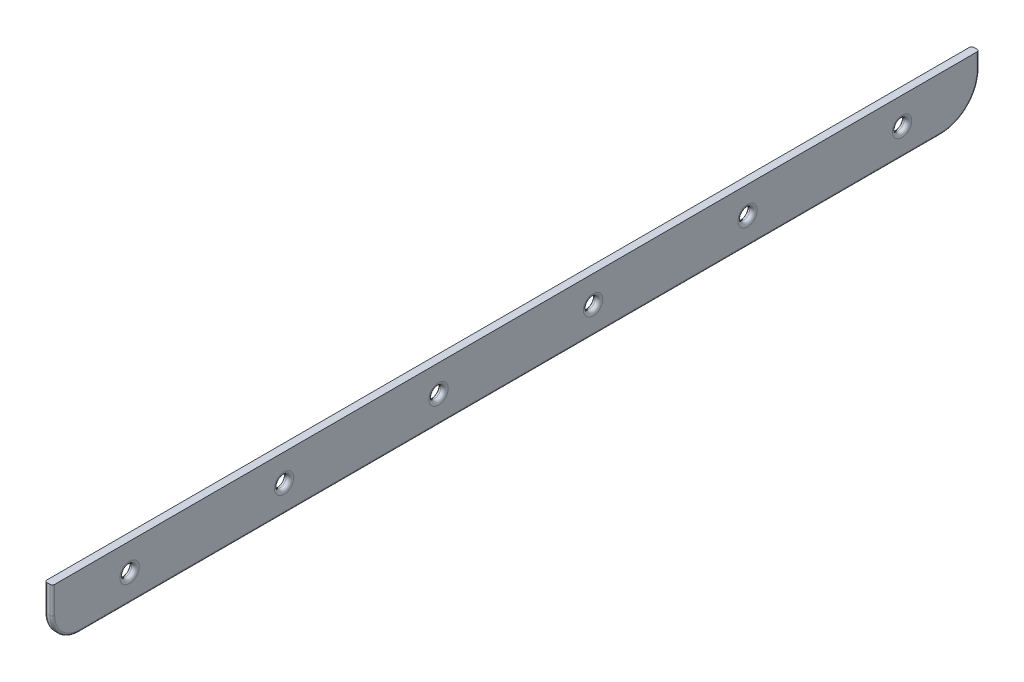
ISO-10303-21;
HEADER;
FILE_DESCRIPTION(('STEP AP214'),'2;1');
FILE_NAME('part.step','',(''),(''),'','','');
FILE_SCHEMA(('AUTOMOTIVE_DESIGN { 1 0 10303 214 1 1 1 1 }'));
ENDSEC;
DATA;
#1=APPLICATION_CONTEXT('core data for automotive mechanical design processes');
#2=APPLICATION_PROTOCOL_DEFINITION('international standard','automotive_design',2000,#1);
#3=PRODUCT_CONTEXT('',#1,'mechanical');
#4=PRODUCT('Part','Part','',(#3));
#5=PRODUCT_RELATED_PRODUCT_CATEGORY('part','',(#4));
#6=PRODUCT_DEFINITION_FORMATION('','',#4);
#7=PRODUCT_DEFINITION_CONTEXT('part definition',#1,'design');
#8=PRODUCT_DEFINITION('design','',#6,#7);
#9=PRODUCT_DEFINITION_SHAPE('','',#8);
#10=(LENGTH_UNIT() NAMED_UNIT(*) SI_UNIT(.MILLI.,.METRE.));
#11=(NAMED_UNIT(*) PLANE_ANGLE_UNIT() SI_UNIT($,.RADIAN.));
#12=(NAMED_UNIT(*) SI_UNIT($,.STERADIAN.) SOLID_ANGLE_UNIT());
#13=UNCERTAINTY_MEASURE_WITH_UNIT(LENGTH_MEASURE(1.E-05),#10,'distance_accuracy_value','');
#14=(GEOMETRIC_REPRESENTATION_CONTEXT(3) GLOBAL_UNCERTAINTY_ASSIGNED_CONTEXT((#13)) GLOBAL_UNIT_ASSIGNED_CONTEXT((#10,
#11,#12)) REPRESENTATION_CONTEXT('',''));
#15=CARTESIAN_POINT('',(0.,0.,0.));
#16=DIRECTION('',(0.,0.,1.));
#17=DIRECTION('',(1.,0.,0.));
#18=AXIS2_PLACEMENT_3D('',#15,#16,#17);
#19=CARTESIAN_POINT('',(10.,-35.0000000000001,565.));
#20=DIRECTION('',(1.,0.,0.));
#21=DIRECTION('',(0.,0.,-1.));
#22=AXIS2_PLACEMENT_3D('',#19,#20,#21);
#23=PLANE('',#22);
#24=CARTESIAN_POINT('',(10.,-35.0000000000001,-500.));
#25=DIRECTION('',(1.,0.,0.));
#26=DIRECTION('',(0.,0.,-1.));
#27=AXIS2_PLACEMENT_3D('',#24,#25,#26);
#28=CIRCLE('',#27,12.5);
#29=CARTESIAN_POINT('',(10.,-35.0000000000001,-512.5));
#30=VERTEX_POINT('',#29);
#31=EDGE_CURVE('E11',#30,#30,#28,.F.);
#32=ORIENTED_EDGE('',*,*,#31,.T.);
#33=EDGE_LOOP('',(#32));
#34=FACE_BOUND('',#33,.T.);
#35=CARTESIAN_POINT('',(10.,-35.0000000000001,-300.));
#36=DIRECTION('',(1.,0.,0.));
#37=DIRECTION('',(0.,0.,-1.));
#38=AXIS2_PLACEMENT_3D('',#35,#36,#37);
#39=CIRCLE('',#38,12.5);
#40=CARTESIAN_POINT('',(10.,-35.0000000000001,-312.5));
#41=VERTEX_POINT('',#40);
#42=EDGE_CURVE('E41',#41,#41,#39,.F.);
#43=ORIENTED_EDGE('',*,*,#42,.T.);
#44=EDGE_LOOP('',(#43));
#45=FACE_BOUND('',#44,.T.);
#46=CARTESIAN_POINT('',(10.,-35.0000000000001,-100.));
#47=DIRECTION('',(1.,0.,0.));
#48=DIRECTION('',(0.,0.,-1.));
#49=AXIS2_PLACEMENT_3D('',#46,#47,#48);
#50=CIRCLE('',#49,12.5);
#51=CARTESIAN_POINT('',(10.,-35.0000000000001,-112.5));
#52=VERTEX_POINT('',#51);
#53=EDGE_CURVE('E201',#52,#52,#50,.F.);
#54=ORIENTED_EDGE('',*,*,#53,.T.);
#55=EDGE_LOOP('',(#54));
#56=FACE_BOUND('',#55,.T.);
#57=CARTESIAN_POINT('',(10.,-35.0000000000001,100.));
#58=DIRECTION('',(1.,0.,0.));
#59=DIRECTION('',(0.,0.,-1.));
#60=AXIS2_PLACEMENT_3D('',#57,#58,#59);
#61=CIRCLE('',#60,12.5);
#62=CARTESIAN_POINT('',(10.,-35.0000000000001,87.5));
#63=VERTEX_POINT('',#62);
#64=EDGE_CURVE('E198',#63,#63,#61,.F.);
#65=ORIENTED_EDGE('',*,*,#64,.T.);
#66=EDGE_LOOP('',(#65));
#67=FACE_BOUND('',#66,.T.);
#68=CARTESIAN_POINT('',(10.,-35.0000000000001,300.));
#69=DIRECTION('',(1.,0.,0.));
#70=DIRECTION('',(0.,0.,-1.));
#71=AXIS2_PLACEMENT_3D('',#68,#69,#70);
#72=CIRCLE('',#71,12.5);
#73=CARTESIAN_POINT('',(10.,-35.0000000000001,287.5));
#74=VERTEX_POINT('',#73);
#75=EDGE_CURVE('E195',#74,#74,#72,.F.);
#76=ORIENTED_EDGE('',*,*,#75,.T.);
#77=EDGE_LOOP('',(#76));
#78=FACE_BOUND('',#77,.T.);
#79=CARTESIAN_POINT('',(10.,-35.0000000000001,500.));
#80=DIRECTION('',(1.,0.,0.));
#81=DIRECTION('',(0.,0.,-1.));
#82=AXIS2_PLACEMENT_3D('',#79,#80,#81);
#83=CIRCLE('',#82,12.5);
#84=CARTESIAN_POINT('',(10.,-35.0000000000001,487.5));
#85=VERTEX_POINT('',#84);
#86=EDGE_CURVE('E192',#85,#85,#83,.F.);
#87=ORIENTED_EDGE('',*,*,#86,.T.);
#88=EDGE_LOOP('',(#87));
#89=FACE_BOUND('',#88,.T.);
#90=DIRECTION('',(0.,0.,1.));
#91=VECTOR('',#90,1.);
#92=CARTESIAN_POINT('',(10.,2.25947334442687E-13,-600.));
#93=LINE('',#92,#91);
#94=CARTESIAN_POINT('',(10.,2.25028849343326E-13,-597.));
#95=VERTEX_POINT('',#94);
#96=CARTESIAN_POINT('',(10.,-1.40528220202159E-13,597.));
#97=VERTEX_POINT('',#96);
#98=EDGE_CURVE('E342',#95,#97,#93,.T.);
#99=ORIENTED_EDGE('',*,*,#98,.T.);
#100=DIRECTION('',(0.,-1.,0.));
#101=VECTOR('',#100,1.);
#102=CARTESIAN_POINT('',(10.,-35.0000000000001,597.));
#103=LINE('',#102,#101);
#104=CARTESIAN_POINT('',(10.,-35.0000000000001,597.));
#105=VERTEX_POINT('',#104);
#106=EDGE_CURVE('E343',#97,#105,#103,.T.);
#107=ORIENTED_EDGE('',*,*,#106,.T.);
#108=CARTESIAN_POINT('',(10.,-35.0000000000001,565.));
#109=DIRECTION('',(1.,0.,0.));
#110=DIRECTION('',(0.,0.,-1.));
#111=AXIS2_PLACEMENT_3D('',#108,#109,#110);
#112=CIRCLE('',#111,32.);
#113=CARTESIAN_POINT('',(10.,-67.0000000000001,565.));
#114=VERTEX_POINT('',#113);
#115=EDGE_CURVE('E153',#105,#114,#112,.T.);
#116=ORIENTED_EDGE('',*,*,#115,.T.);
#117=DIRECTION('',(0.,0.,-1.));
#118=VECTOR('',#117,1.);
#119=CARTESIAN_POINT('',(10.,-67.0000000000001,-550.));
#120=LINE('',#119,#118);
#121=CARTESIAN_POINT('',(10.,-67.0000000000001,-550.));
#122=VERTEX_POINT('',#121);
#123=EDGE_CURVE('E409',#114,#122,#120,.T.);
#124=ORIENTED_EDGE('',*,*,#123,.T.);
#125=CARTESIAN_POINT('',(10.,-20.0000000000001,-550.));
#126=DIRECTION('',(1.,0.,0.));
#127=DIRECTION('',(0.,0.,-1.));
#128=AXIS2_PLACEMENT_3D('',#125,#126,#127);
#129=CIRCLE('',#128,47.);
#130=CARTESIAN_POINT('',(10.,-20.0000000000001,-597.));
#131=VERTEX_POINT('',#130);
#132=EDGE_CURVE('E57',#122,#131,#129,.T.);
#133=ORIENTED_EDGE('',*,*,#132,.T.);
#134=DIRECTION('',(0.,1.,0.));
#135=VECTOR('',#134,1.);
#136=CARTESIAN_POINT('',(10.,2.28983498828939E-13,-597.));
#137=LINE('',#136,#135);
#138=EDGE_CURVE('E344',#131,#95,#137,.T.);
#139=ORIENTED_EDGE('',*,*,#138,.T.);
#140=EDGE_LOOP('',(#99,#107,#116,#124,#133,#139));
#141=FACE_BOUND('',#140,.T.);
#142=ADVANCED_FACE('F32',(#34,#45,#56,#67,#78,#89,#141),#23,.T.);
#143=CARTESIAN_POINT('',(0.,-35.0000000000001,565.));
#144=DIRECTION('',(1.,0.,0.));
#145=DIRECTION('',(0.,0.,-1.));
#146=AXIS2_PLACEMENT_3D('',#143,#144,#145);
#147=PLANE('',#146);
#148=CARTESIAN_POINT('',(0.,-35.0000000000001,-500.));
#149=DIRECTION('',(1.,0.,0.));
#150=DIRECTION('',(0.,0.,-1.));
#151=AXIS2_PLACEMENT_3D('',#148,#149,#150);
#152=CIRCLE('',#151,12.5);
#153=CARTESIAN_POINT('',(0.,-35.0000000000001,-512.5));
#154=VERTEX_POINT('',#153);
#155=EDGE_CURVE('E189',#154,#154,#152,.T.);
#156=ORIENTED_EDGE('',*,*,#155,.T.);
#157=EDGE_LOOP('',(#156));
#158=FACE_BOUND('',#157,.T.);
#159=CARTESIAN_POINT('',(0.,-35.0000000000001,-300.));
#160=DIRECTION('',(1.,0.,0.));
#161=DIRECTION('',(0.,0.,-1.));
#162=AXIS2_PLACEMENT_3D('',#159,#160,#161);
#163=CIRCLE('',#162,12.5);
#164=CARTESIAN_POINT('',(0.,-35.0000000000001,-312.5));
#165=VERTEX_POINT('',#164);
#166=EDGE_CURVE('E186',#165,#165,#163,.T.);
#167=ORIENTED_EDGE('',*,*,#166,.T.);
#168=EDGE_LOOP('',(#167));
#169=FACE_BOUND('',#168,.T.);
#170=CARTESIAN_POINT('',(0.,-35.0000000000001,-100.));
#171=DIRECTION('',(1.,0.,0.));
#172=DIRECTION('',(0.,0.,-1.));
#173=AXIS2_PLACEMENT_3D('',#170,#171,#172);
#174=CIRCLE('',#173,12.5);
#175=CARTESIAN_POINT('',(0.,-35.0000000000001,-112.5));
#176=VERTEX_POINT('',#175);
#177=EDGE_CURVE('E183',#176,#176,#174,.T.);
#178=ORIENTED_EDGE('',*,*,#177,.T.);
#179=EDGE_LOOP('',(#178));
#180=FACE_BOUND('',#179,.T.);
#181=CARTESIAN_POINT('',(0.,-35.0000000000001,100.));
#182=DIRECTION('',(1.,0.,0.));
#183=DIRECTION('',(0.,0.,-1.));
#184=AXIS2_PLACEMENT_3D('',#181,#182,#183);
#185=CIRCLE('',#184,12.5);
#186=CARTESIAN_POINT('',(0.,-35.0000000000001,87.5));
#187=VERTEX_POINT('',#186);
#188=EDGE_CURVE('E180',#187,#187,#185,.T.);
#189=ORIENTED_EDGE('',*,*,#188,.T.);
#190=EDGE_LOOP('',(#189));
#191=FACE_BOUND('',#190,.T.);
#192=CARTESIAN_POINT('',(0.,-35.0000000000001,300.));
#193=DIRECTION('',(1.,0.,0.));
#194=DIRECTION('',(0.,0.,-1.));
#195=AXIS2_PLACEMENT_3D('',#192,#193,#194);
#196=CIRCLE('',#195,12.5);
#197=CARTESIAN_POINT('',(0.,-35.0000000000001,287.5));
#198=VERTEX_POINT('',#197);
#199=EDGE_CURVE('E176',#198,#198,#196,.T.);
#200=ORIENTED_EDGE('',*,*,#199,.T.);
#201=EDGE_LOOP('',(#200));
#202=FACE_BOUND('',#201,.T.);
#203=CARTESIAN_POINT('',(0.,-35.0000000000001,500.));
#204=DIRECTION('',(1.,0.,0.));
#205=DIRECTION('',(0.,0.,-1.));
#206=AXIS2_PLACEMENT_3D('',#203,#204,#205);
#207=CIRCLE('',#206,12.5);
#208=CARTESIAN_POINT('',(0.,-35.0000000000001,487.5));
#209=VERTEX_POINT('',#208);
#210=EDGE_CURVE('E173',#209,#209,#207,.T.);
#211=ORIENTED_EDGE('',*,*,#210,.T.);
#212=EDGE_LOOP('',(#211));
#213=FACE_BOUND('',#212,.T.);
#214=CARTESIAN_POINT('',(0.,-35.0000000000001,565.));
#215=DIRECTION('',(1.,0.,0.));
#216=DIRECTION('',(0.,0.,-1.));
#217=AXIS2_PLACEMENT_3D('',#214,#215,#216);
#218=CIRCLE('',#217,32.);
#219=CARTESIAN_POINT('',(0.,-67.0000000000001,565.));
#220=VERTEX_POINT('',#219);
#221=CARTESIAN_POINT('',(0.,-35.0000000000001,597.));
#222=VERTEX_POINT('',#221);
#223=EDGE_CURVE('E390',#220,#222,#218,.F.);
#224=ORIENTED_EDGE('',*,*,#223,.T.);
#225=DIRECTION('',(0.,-1.,0.));
#226=VECTOR('',#225,1.);
#227=CARTESIAN_POINT('',(0.,-35.0000000000002,597.));
#228=LINE('',#227,#226);
#229=CARTESIAN_POINT('',(0.,-1.40528220202159E-13,597.));
#230=VERTEX_POINT('',#229);
#231=EDGE_CURVE('E392',#222,#230,#228,.F.);
#232=ORIENTED_EDGE('',*,*,#231,.T.);
#233=DIRECTION('',(0.,0.,1.));
#234=VECTOR('',#233,1.);
#235=CARTESIAN_POINT('',(0.,2.25947334442687E-13,-600.));
#236=LINE('',#235,#234);
#237=CARTESIAN_POINT('',(0.,2.25028849343326E-13,-597.));
#238=VERTEX_POINT('',#237);
#239=EDGE_CURVE('E347',#238,#230,#236,.T.);
#240=ORIENTED_EDGE('',*,*,#239,.F.);
#241=DIRECTION('',(0.,1.,0.));
#242=VECTOR('',#241,1.);
#243=CARTESIAN_POINT('',(0.,-35.0000000000001,-597.));
#244=LINE('',#243,#242);
#245=CARTESIAN_POINT('',(0.,-20.0000000000001,-597.));
#246=VERTEX_POINT('',#245);
#247=EDGE_CURVE('E388',#238,#246,#244,.F.);
#248=ORIENTED_EDGE('',*,*,#247,.T.);
#249=CARTESIAN_POINT('',(0.,-20.0000000000001,-550.));
#250=DIRECTION('',(1.,0.,0.));
#251=DIRECTION('',(0.,0.,-1.));
#252=AXIS2_PLACEMENT_3D('',#249,#250,#251);
#253=CIRCLE('',#252,47.);
#254=CARTESIAN_POINT('',(0.,-67.0000000000001,-550.));
#255=VERTEX_POINT('',#254);
#256=EDGE_CURVE('E386',#246,#255,#253,.F.);
#257=ORIENTED_EDGE('',*,*,#256,.T.);
#258=DIRECTION('',(0.,0.,-1.));
#259=VECTOR('',#258,1.);
#260=CARTESIAN_POINT('',(0.,-67.0000000000001,565.));
#261=LINE('',#260,#259);
#262=EDGE_CURVE('E384',#255,#220,#261,.F.);
#263=ORIENTED_EDGE('',*,*,#262,.T.);
#264=EDGE_LOOP('',(#224,#232,#240,#248,#257,#263));
#265=FACE_BOUND('',#264,.T.);
#266=ADVANCED_FACE('F234',(#158,#169,#180,#191,#202,#213,#265),#147,.F.);
#267=CARTESIAN_POINT('',(10.,2.25947334442687E-13,-600.));
#268=DIRECTION('',(0.,-1.,0.));
#269=DIRECTION('',(0.,0.,-1.));
#270=AXIS2_PLACEMENT_3D('',#267,#268,#269);
#271=PLANE('',#270);
#272=ORIENTED_EDGE('',*,*,#239,.T.);
#273=CARTESIAN_POINT('',(3.,-1.40528220202159E-13,597.));
#274=DIRECTION('',(0.,-1.,0.));
#275=DIRECTION('',(0.,0.,-1.));
#276=AXIS2_PLACEMENT_3D('',#273,#274,#275);
#277=CIRCLE('',#276,3.);
#278=CARTESIAN_POINT('',(3.,-1.41446705301519E-13,600.));
#279=VERTEX_POINT('',#278);
#280=EDGE_CURVE('E136',#230,#279,#277,.F.);
#281=ORIENTED_EDGE('',*,*,#280,.T.);
#282=DIRECTION('',(-1.,0.,0.));
#283=VECTOR('',#282,1.);
#284=CARTESIAN_POINT('',(10.,-1.41446705301519E-13,600.));
#285=LINE('',#284,#283);
#286=CARTESIAN_POINT('',(7.,-1.41446705301519E-13,600.));
#287=VERTEX_POINT('',#286);
#288=EDGE_CURVE('E146',#287,#279,#285,.T.);
#289=ORIENTED_EDGE('',*,*,#288,.F.);
#290=CARTESIAN_POINT('',(7.,-1.38777878078145E-13,597.));
#291=DIRECTION('',(0.,-1.,0.));
#292=DIRECTION('',(0.,0.,-1.));
#293=AXIS2_PLACEMENT_3D('',#290,#291,#292);
#294=CIRCLE('',#293,3.);
#295=EDGE_CURVE('E150',#287,#97,#294,.F.);
#296=ORIENTED_EDGE('',*,*,#295,.T.);
#297=ORIENTED_EDGE('',*,*,#98,.F.);
#298=CARTESIAN_POINT('',(7.,2.28983498828939E-13,-597.));
#299=DIRECTION('',(0.,-1.,0.));
#300=DIRECTION('',(0.,0.,-1.));
#301=AXIS2_PLACEMENT_3D('',#298,#299,#300);
#302=CIRCLE('',#301,3.);
#303=CARTESIAN_POINT('',(7.,2.25947334442687E-13,-600.));
#304=VERTEX_POINT('',#303);
#305=EDGE_CURVE('E394',#95,#304,#302,.F.);
#306=ORIENTED_EDGE('',*,*,#305,.T.);
#307=DIRECTION('',(-1.,0.,0.));
#308=VECTOR('',#307,1.);
#309=CARTESIAN_POINT('',(10.,2.25947334442687E-13,-600.));
#310=LINE('',#309,#308);
#311=CARTESIAN_POINT('',(3.,2.25947334442687E-13,-600.));
#312=VERTEX_POINT('',#311);
#313=EDGE_CURVE('E346',#304,#312,#310,.T.);
#314=ORIENTED_EDGE('',*,*,#313,.T.);
#315=CARTESIAN_POINT('',(3.,2.25514051876985E-13,-597.));
#316=DIRECTION('',(0.,-1.,0.));
#317=DIRECTION('',(0.,0.,-1.));
#318=AXIS2_PLACEMENT_3D('',#315,#316,#317);
#319=CIRCLE('',#318,3.);
#320=EDGE_CURVE('E397',#312,#238,#319,.F.);
#321=ORIENTED_EDGE('',*,*,#320,.T.);
#322=EDGE_LOOP('',(#272,#281,#289,#296,#297,#306,#314,#321));
#323=FACE_BOUND('',#322,.T.);
#324=ADVANCED_FACE('F240',(#323),#271,.F.);
#325=CARTESIAN_POINT('',(10.,-1.41446705301519E-13,600.));
#326=DIRECTION('',(0.,0.,-1.));
#327=DIRECTION('',(0.,1.,0.));
#328=AXIS2_PLACEMENT_3D('',#325,#326,#327);
#329=PLANE('',#328);
#330=ORIENTED_EDGE('',*,*,#288,.T.);
#331=DIRECTION('',(0.,-1.,0.));
#332=VECTOR('',#331,1.);
#333=CARTESIAN_POINT('',(3.,-1.41446705301519E-13,600.));
#334=LINE('',#333,#332);
#335=CARTESIAN_POINT('',(3.,-35.0000000000001,600.));
#336=VERTEX_POINT('',#335);
#337=EDGE_CURVE('E145',#279,#336,#334,.T.);
#338=ORIENTED_EDGE('',*,*,#337,.T.);
#339=DIRECTION('',(-1.,0.,0.));
#340=VECTOR('',#339,1.);
#341=CARTESIAN_POINT('',(10.,-35.0000000000001,600.));
#342=LINE('',#341,#340);
#343=CARTESIAN_POINT('',(7.,-35.0000000000001,600.));
#344=VERTEX_POINT('',#343);
#345=EDGE_CURVE('E129',#344,#336,#342,.T.);
#346=ORIENTED_EDGE('',*,*,#345,.F.);
#347=DIRECTION('',(0.,-1.,0.));
#348=VECTOR('',#347,1.);
#349=CARTESIAN_POINT('',(7.,-1.41355181528167E-13,600.));
#350=LINE('',#349,#348);
#351=EDGE_CURVE('E142',#344,#287,#350,.F.);
#352=ORIENTED_EDGE('',*,*,#351,.T.);
#353=EDGE_LOOP('',(#330,#338,#346,#352));
#354=FACE_BOUND('',#353,.T.);
#355=ADVANCED_FACE('F141',(#354),#329,.F.);
#356=CARTESIAN_POINT('',(10.,-35.0000000000001,565.));
#357=DIRECTION('',(-1.,0.,0.));
#358=DIRECTION('',(0.,0.,1.));
#359=AXIS2_PLACEMENT_3D('',#356,#357,#358);
#360=CYLINDRICAL_SURFACE('',#359,35.);
#361=ORIENTED_EDGE('',*,*,#345,.T.);
#362=CARTESIAN_POINT('',(3.,-35.0000000000001,565.));
#363=DIRECTION('',(1.,0.,0.));
#364=DIRECTION('',(0.,0.,-1.));
#365=AXIS2_PLACEMENT_3D('',#362,#363,#364);
#366=CIRCLE('',#365,35.);
#367=CARTESIAN_POINT('',(3.,-70.0000000000001,565.));
#368=VERTEX_POINT('',#367);
#369=EDGE_CURVE('E135',#336,#368,#366,.T.);
#370=ORIENTED_EDGE('',*,*,#369,.T.);
#371=DIRECTION('',(-1.,0.,0.));
#372=VECTOR('',#371,1.);
#373=CARTESIAN_POINT('',(10.,-70.0000000000001,565.));
#374=LINE('',#373,#372);
#375=CARTESIAN_POINT('',(7.,-70.0000000000001,565.));
#376=VERTEX_POINT('',#375);
#377=EDGE_CURVE('E131',#376,#368,#374,.T.);
#378=ORIENTED_EDGE('',*,*,#377,.F.);
#379=CARTESIAN_POINT('',(7.,-35.0000000000001,565.));
#380=DIRECTION('',(1.,0.,0.));
#381=DIRECTION('',(0.,0.,-1.));
#382=AXIS2_PLACEMENT_3D('',#379,#380,#381);
#383=CIRCLE('',#382,35.);
#384=EDGE_CURVE('E126',#376,#344,#383,.F.);
#385=ORIENTED_EDGE('',*,*,#384,.T.);
#386=EDGE_LOOP('',(#361,#370,#378,#385));
#387=FACE_BOUND('',#386,.T.);
#388=ADVANCED_FACE('F128',(#387),#360,.T.);
#389=CARTESIAN_POINT('',(10.,-70.0000000000001,565.));
#390=DIRECTION('',(0.,1.,0.));
#391=DIRECTION('',(0.,0.,1.));
#392=AXIS2_PLACEMENT_3D('',#389,#390,#391);
#393=PLANE('',#392);
#394=ORIENTED_EDGE('',*,*,#377,.T.);
#395=DIRECTION('',(0.,0.,-1.));
#396=VECTOR('',#395,1.);
#397=CARTESIAN_POINT('',(3.,-70.0000000000001,565.));
#398=LINE('',#397,#396);
#399=CARTESIAN_POINT('',(3.,-70.0000000000001,-550.));
#400=VERTEX_POINT('',#399);
#401=EDGE_CURVE('E177',#368,#400,#398,.T.);
#402=ORIENTED_EDGE('',*,*,#401,.T.);
#403=DIRECTION('',(-1.,0.,0.));
#404=VECTOR('',#403,1.);
#405=CARTESIAN_POINT('',(10.,-70.0000000000001,-550.));
#406=LINE('',#405,#404);
#407=CARTESIAN_POINT('',(7.,-70.0000000000001,-550.));
#408=VERTEX_POINT('',#407);
#409=EDGE_CURVE('E378',#408,#400,#406,.T.);
#410=ORIENTED_EDGE('',*,*,#409,.F.);
#411=DIRECTION('',(0.,0.,-1.));
#412=VECTOR('',#411,1.);
#413=CARTESIAN_POINT('',(7.,-70.0000000000001,565.));
#414=LINE('',#413,#412);
#415=EDGE_CURVE('E349',#408,#376,#414,.F.);
#416=ORIENTED_EDGE('',*,*,#415,.T.);
#417=EDGE_LOOP('',(#394,#402,#410,#416));
#418=FACE_BOUND('',#417,.T.);
#419=ADVANCED_FACE('F253',(#418),#393,.F.);
#420=CARTESIAN_POINT('',(10.,-20.0000000000001,-550.));
#421=DIRECTION('',(-1.,0.,0.));
#422=DIRECTION('',(0.,0.,1.));
#423=AXIS2_PLACEMENT_3D('',#420,#421,#422);
#424=CYLINDRICAL_SURFACE('',#423,50.);
#425=ORIENTED_EDGE('',*,*,#409,.T.);
#426=CARTESIAN_POINT('',(3.,-20.0000000000001,-550.));
#427=DIRECTION('',(1.,0.,0.));
#428=DIRECTION('',(0.,0.,-1.));
#429=AXIS2_PLACEMENT_3D('',#426,#427,#428);
#430=CIRCLE('',#429,50.);
#431=CARTESIAN_POINT('',(3.,-20.0000000000001,-600.));
#432=VERTEX_POINT('',#431);
#433=EDGE_CURVE('E407',#400,#432,#430,.T.);
#434=ORIENTED_EDGE('',*,*,#433,.T.);
#435=DIRECTION('',(-1.,0.,0.));
#436=VECTOR('',#435,1.);
#437=CARTESIAN_POINT('',(10.,-20.0000000000001,-600.));
#438=LINE('',#437,#436);
#439=CARTESIAN_POINT('',(7.,-20.0000000000001,-600.));
#440=VERTEX_POINT('',#439);
#441=EDGE_CURVE('E375',#440,#432,#438,.T.);
#442=ORIENTED_EDGE('',*,*,#441,.F.);
#443=CARTESIAN_POINT('',(7.,-20.0000000000001,-550.));
#444=DIRECTION('',(1.,0.,0.));
#445=DIRECTION('',(0.,0.,-1.));
#446=AXIS2_PLACEMENT_3D('',#443,#444,#445);
#447=CIRCLE('',#446,50.);
#448=EDGE_CURVE('E405',#440,#408,#447,.F.);
#449=ORIENTED_EDGE('',*,*,#448,.T.);
#450=EDGE_LOOP('',(#425,#434,#442,#449));
#451=FACE_BOUND('',#450,.T.);
#452=ADVANCED_FACE('F249',(#451),#424,.T.);
#453=CARTESIAN_POINT('',(10.,-20.0000000000001,-600.));
#454=DIRECTION('',(0.,0.,1.));
#455=DIRECTION('',(1.,0.,0.));
#456=AXIS2_PLACEMENT_3D('',#453,#454,#455);
#457=PLANE('',#456);
#458=ORIENTED_EDGE('',*,*,#441,.T.);
#459=DIRECTION('',(0.,1.,0.));
#460=VECTOR('',#459,1.);
#461=CARTESIAN_POINT('',(3.,-20.0000000000001,-600.));
#462=LINE('',#461,#460);
#463=EDGE_CURVE('E403',#432,#312,#462,.T.);
#464=ORIENTED_EDGE('',*,*,#463,.T.);
#465=ORIENTED_EDGE('',*,*,#313,.F.);
#466=DIRECTION('',(0.,1.,0.));
#467=VECTOR('',#466,1.);
#468=CARTESIAN_POINT('',(7.,-20.0000000000001,-600.));
#469=LINE('',#468,#467);
#470=EDGE_CURVE('E401',#304,#440,#469,.F.);
#471=ORIENTED_EDGE('',*,*,#470,.T.);
#472=EDGE_LOOP('',(#458,#464,#465,#471));
#473=FACE_BOUND('',#472,.T.);
#474=ADVANCED_FACE('F245',(#473),#457,.F.);
#475=CARTESIAN_POINT('',(3.,-20.0000000000001,-597.));
#476=DIRECTION('',(0.,1.,0.));
#477=DIRECTION('',(0.,0.,1.));
#478=AXIS2_PLACEMENT_3D('',#475,#476,#477);
#479=CYLINDRICAL_SURFACE('',#478,3.);
#480=ORIENTED_EDGE('',*,*,#320,.F.);
#481=ORIENTED_EDGE('',*,*,#463,.F.);
#482=CARTESIAN_POINT('',(3.,-20.0000000000001,-597.));
#483=DIRECTION('',(0.,-1.,0.));
#484=DIRECTION('',(0.,0.,-1.));
#485=AXIS2_PLACEMENT_3D('',#482,#483,#484);
#486=CIRCLE('',#485,3.);
#487=EDGE_CURVE('E164',#246,#432,#486,.T.);
#488=ORIENTED_EDGE('',*,*,#487,.F.);
#489=ORIENTED_EDGE('',*,*,#247,.F.);
#490=EDGE_LOOP('',(#480,#481,#488,#489));
#491=FACE_BOUND('',#490,.T.);
#492=ADVANCED_FACE('F248',(#491),#479,.T.);
#493=CARTESIAN_POINT('',(3.,-20.0000000000001,-550.));
#494=DIRECTION('',(1.,0.,0.));
#495=DIRECTION('',(0.,0.,-1.));
#496=AXIS2_PLACEMENT_3D('',#493,#494,#495);
#497=TOROIDAL_SURFACE('',#496,47.,3.);
#498=ORIENTED_EDGE('',*,*,#487,.T.);
#499=ORIENTED_EDGE('',*,*,#433,.F.);
#500=CARTESIAN_POINT('',(3.,-67.0000000000002,-550.));
#501=DIRECTION('',(0.,0.,1.));
#502=DIRECTION('',(1.,0.,0.));
#503=AXIS2_PLACEMENT_3D('',#500,#501,#502);
#504=CIRCLE('',#503,3.);
#505=EDGE_CURVE('E359',#255,#400,#504,.T.);
#506=ORIENTED_EDGE('',*,*,#505,.F.);
#507=ORIENTED_EDGE('',*,*,#256,.F.);
#508=EDGE_LOOP('',(#498,#499,#506,#507));
#509=FACE_BOUND('',#508,.T.);
#510=ADVANCED_FACE('F277',(#509),#497,.T.);
#511=CARTESIAN_POINT('',(3.,-67.0000000000001,565.));
#512=DIRECTION('',(0.,0.,-1.));
#513=DIRECTION('',(0.,1.,0.));
#514=AXIS2_PLACEMENT_3D('',#511,#512,#513);
#515=CYLINDRICAL_SURFACE('',#514,3.);
#516=ORIENTED_EDGE('',*,*,#505,.T.);
#517=ORIENTED_EDGE('',*,*,#401,.F.);
#518=CARTESIAN_POINT('',(3.,-67.0000000000001,565.));
#519=DIRECTION('',(0.,0.,1.));
#520=DIRECTION('',(1.,0.,0.));
#521=AXIS2_PLACEMENT_3D('',#518,#519,#520);
#522=CIRCLE('',#521,3.);
#523=EDGE_CURVE('E357',#220,#368,#522,.T.);
#524=ORIENTED_EDGE('',*,*,#523,.F.);
#525=ORIENTED_EDGE('',*,*,#262,.F.);
#526=EDGE_LOOP('',(#516,#517,#524,#525));
#527=FACE_BOUND('',#526,.T.);
#528=ADVANCED_FACE('F273',(#527),#515,.T.);
#529=CARTESIAN_POINT('',(3.,-35.0000000000001,565.));
#530=DIRECTION('',(1.,0.,0.));
#531=DIRECTION('',(0.,0.,-1.));
#532=AXIS2_PLACEMENT_3D('',#529,#530,#531);
#533=TOROIDAL_SURFACE('',#532,32.,3.);
#534=ORIENTED_EDGE('',*,*,#523,.T.);
#535=ORIENTED_EDGE('',*,*,#369,.F.);
#536=CARTESIAN_POINT('',(3.,-35.0000000000001,597.));
#537=DIRECTION('',(0.,1.,0.));
#538=DIRECTION('',(0.,0.,1.));
#539=AXIS2_PLACEMENT_3D('',#536,#537,#538);
#540=CIRCLE('',#539,3.);
#541=EDGE_CURVE('E172',#222,#336,#540,.T.);
#542=ORIENTED_EDGE('',*,*,#541,.F.);
#543=ORIENTED_EDGE('',*,*,#223,.F.);
#544=EDGE_LOOP('',(#534,#535,#542,#543));
#545=FACE_BOUND('',#544,.T.);
#546=ADVANCED_FACE('F269',(#545),#533,.T.);
#547=CARTESIAN_POINT('',(3.,-1.31930507947589E-13,597.));
#548=DIRECTION('',(0.,-1.,0.));
#549=DIRECTION('',(0.,0.,-1.));
#550=AXIS2_PLACEMENT_3D('',#547,#548,#549);
#551=CYLINDRICAL_SURFACE('',#550,3.);
#552=ORIENTED_EDGE('',*,*,#280,.F.);
#553=ORIENTED_EDGE('',*,*,#231,.F.);
#554=ORIENTED_EDGE('',*,*,#541,.T.);
#555=ORIENTED_EDGE('',*,*,#337,.F.);
#556=EDGE_LOOP('',(#552,#553,#554,#555));
#557=FACE_BOUND('',#556,.T.);
#558=ADVANCED_FACE('F265',(#557),#551,.T.);
#559=CARTESIAN_POINT('',(7.,-35.0000000000001,-597.));
#560=DIRECTION('',(0.,-1.,0.));
#561=DIRECTION('',(0.,0.,-1.));
#562=AXIS2_PLACEMENT_3D('',#559,#560,#561);
#563=CYLINDRICAL_SURFACE('',#562,3.);
#564=ORIENTED_EDGE('',*,*,#305,.F.);
#565=ORIENTED_EDGE('',*,*,#138,.F.);
#566=CARTESIAN_POINT('',(7.,-20.0000000000001,-597.));
#567=DIRECTION('',(0.,-1.,0.));
#568=DIRECTION('',(0.,0.,-1.));
#569=AXIS2_PLACEMENT_3D('',#566,#567,#568);
#570=CIRCLE('',#569,3.);
#571=EDGE_CURVE('E169',#440,#131,#570,.T.);
#572=ORIENTED_EDGE('',*,*,#571,.F.);
#573=ORIENTED_EDGE('',*,*,#470,.F.);
#574=EDGE_LOOP('',(#564,#565,#572,#573));
#575=FACE_BOUND('',#574,.T.);
#576=ADVANCED_FACE('F268',(#575),#563,.T.);
#577=CARTESIAN_POINT('',(7.,-20.0000000000001,-550.));
#578=DIRECTION('',(1.,0.,0.));
#579=DIRECTION('',(0.,0.,-1.));
#580=AXIS2_PLACEMENT_3D('',#577,#578,#579);
#581=TOROIDAL_SURFACE('',#580,47.,3.);
#582=ORIENTED_EDGE('',*,*,#571,.T.);
#583=ORIENTED_EDGE('',*,*,#132,.F.);
#584=CARTESIAN_POINT('',(7.,-67.0000000000002,-550.));
#585=DIRECTION('',(0.,0.,1.));
#586=DIRECTION('',(1.,0.,0.));
#587=AXIS2_PLACEMENT_3D('',#584,#585,#586);
#588=CIRCLE('',#587,3.);
#589=EDGE_CURVE('E158',#408,#122,#588,.T.);
#590=ORIENTED_EDGE('',*,*,#589,.F.);
#591=ORIENTED_EDGE('',*,*,#448,.F.);
#592=EDGE_LOOP('',(#582,#583,#590,#591));
#593=FACE_BOUND('',#592,.T.);
#594=ADVANCED_FACE('F293',(#593),#581,.T.);
#595=CARTESIAN_POINT('',(7.,-67.0000000000001,565.));
#596=DIRECTION('',(0.,0.,1.));
#597=DIRECTION('',(0.,-1.,0.));
#598=AXIS2_PLACEMENT_3D('',#595,#596,#597);
#599=CYLINDRICAL_SURFACE('',#598,3.);
#600=ORIENTED_EDGE('',*,*,#589,.T.);
#601=ORIENTED_EDGE('',*,*,#123,.F.);
#602=CARTESIAN_POINT('',(7.,-67.0000000000001,565.));
#603=DIRECTION('',(0.,0.,1.));
#604=DIRECTION('',(1.,0.,0.));
#605=AXIS2_PLACEMENT_3D('',#602,#603,#604);
#606=CIRCLE('',#605,3.);
#607=EDGE_CURVE('E155',#376,#114,#606,.T.);
#608=ORIENTED_EDGE('',*,*,#607,.F.);
#609=ORIENTED_EDGE('',*,*,#415,.F.);
#610=EDGE_LOOP('',(#600,#601,#608,#609));
#611=FACE_BOUND('',#610,.T.);
#612=ADVANCED_FACE('F290',(#611),#599,.T.);
#613=CARTESIAN_POINT('',(7.,-35.0000000000001,565.));
#614=DIRECTION('',(1.,0.,0.));
#615=DIRECTION('',(0.,0.,-1.));
#616=AXIS2_PLACEMENT_3D('',#613,#614,#615);
#617=TOROIDAL_SURFACE('',#616,32.,3.);
#618=ORIENTED_EDGE('',*,*,#607,.T.);
#619=ORIENTED_EDGE('',*,*,#115,.F.);
#620=CARTESIAN_POINT('',(7.,-35.0000000000001,597.));
#621=DIRECTION('',(0.,1.,0.));
#622=DIRECTION('',(-1.,0.,0.));
#623=AXIS2_PLACEMENT_3D('',#620,#621,#622);
#624=CIRCLE('',#623,3.);
#625=EDGE_CURVE('E49',#344,#105,#624,.T.);
#626=ORIENTED_EDGE('',*,*,#625,.F.);
#627=ORIENTED_EDGE('',*,*,#384,.F.);
#628=EDGE_LOOP('',(#618,#619,#626,#627));
#629=FACE_BOUND('',#628,.T.);
#630=ADVANCED_FACE('F152',(#629),#617,.T.);
#631=CARTESIAN_POINT('',(7.,-35.0000000000002,597.));
#632=DIRECTION('',(0.,1.,0.));
#633=DIRECTION('',(0.,0.,1.));
#634=AXIS2_PLACEMENT_3D('',#631,#632,#633);
#635=CYLINDRICAL_SURFACE('',#634,3.);
#636=ORIENTED_EDGE('',*,*,#295,.F.);
#637=ORIENTED_EDGE('',*,*,#351,.F.);
#638=ORIENTED_EDGE('',*,*,#625,.T.);
#639=ORIENTED_EDGE('',*,*,#106,.F.);
#640=EDGE_LOOP('',(#636,#637,#638,#639));
#641=FACE_BOUND('',#640,.T.);
#642=ADVANCED_FACE('F149',(#641),#635,.T.);
#643=CARTESIAN_POINT('',(5.,-35.0000000000001,-500.));
#644=DIRECTION('',(1.,0.,0.));
#645=DIRECTION('',(0.,0.,-1.));
#646=AXIS2_PLACEMENT_3D('',#643,#644,#645);
#647=TOROIDAL_SURFACE('',#646,12.5,5.);
#648=ORIENTED_EDGE('',*,*,#31,.F.);
#649=EDGE_LOOP('',(#648));
#650=FACE_BOUND('',#649,.T.);
#651=CARTESIAN_POINT('',(5.,-35.0000000000001,-500.));
#652=DIRECTION('',(1.,0.,0.));
#653=DIRECTION('',(0.,0.,-1.));
#654=AXIS2_PLACEMENT_3D('',#651,#652,#653);
#655=CIRCLE('',#654,7.49999999999995);
#656=CARTESIAN_POINT('',(5.,-35.0000000000001,-507.5));
#657=VERTEX_POINT('',#656);
#658=EDGE_CURVE('E156',#657,#657,#655,.T.);
#659=ORIENTED_EDGE('',*,*,#658,.F.);
#660=EDGE_LOOP('',(#659));
#661=FACE_BOUND('',#660,.T.);
#662=ADVANCED_FACE('F287',(#650,#661),#647,.T.);
#663=CARTESIAN_POINT('',(5.,-35.0000000000001,-500.));
#664=DIRECTION('',(1.,0.,0.));
#665=DIRECTION('',(0.,0.,-1.));
#666=AXIS2_PLACEMENT_3D('',#663,#664,#665);
#667=TOROIDAL_SURFACE('',#666,12.5,5.);
#668=ORIENTED_EDGE('',*,*,#658,.T.);
#669=EDGE_LOOP('',(#668));
#670=FACE_BOUND('',#669,.T.);
#671=ORIENTED_EDGE('',*,*,#155,.F.);
#672=EDGE_LOOP('',(#671));
#673=FACE_BOUND('',#672,.T.);
#674=ADVANCED_FACE('F301',(#670,#673),#667,.T.);
#675=CARTESIAN_POINT('',(5.,-35.0000000000001,-300.));
#676=DIRECTION('',(1.,0.,0.));
#677=DIRECTION('',(0.,0.,-1.));
#678=AXIS2_PLACEMENT_3D('',#675,#676,#677);
#679=TOROIDAL_SURFACE('',#678,12.5,5.);
#680=ORIENTED_EDGE('',*,*,#42,.F.);
#681=EDGE_LOOP('',(#680));
#682=FACE_BOUND('',#681,.T.);
#683=CARTESIAN_POINT('',(5.,-35.0000000000001,-300.));
#684=DIRECTION('',(1.,0.,0.));
#685=DIRECTION('',(0.,0.,-1.));
#686=AXIS2_PLACEMENT_3D('',#683,#684,#685);
#687=CIRCLE('',#686,7.50000000000001);
#688=CARTESIAN_POINT('',(5.,-35.0000000000001,-307.5));
#689=VERTEX_POINT('',#688);
#690=EDGE_CURVE('E161',#689,#689,#687,.T.);
#691=ORIENTED_EDGE('',*,*,#690,.F.);
#692=EDGE_LOOP('',(#691));
#693=FACE_BOUND('',#692,.T.);
#694=ADVANCED_FACE('F304',(#682,#693),#679,.T.);
#695=CARTESIAN_POINT('',(5.,-35.0000000000001,-300.));
#696=DIRECTION('',(1.,0.,0.));
#697=DIRECTION('',(0.,0.,-1.));
#698=AXIS2_PLACEMENT_3D('',#695,#696,#697);
#699=TOROIDAL_SURFACE('',#698,12.5,5.);
#700=ORIENTED_EDGE('',*,*,#690,.T.);
#701=EDGE_LOOP('',(#700));
#702=FACE_BOUND('',#701,.T.);
#703=ORIENTED_EDGE('',*,*,#166,.F.);
#704=EDGE_LOOP('',(#703));
#705=FACE_BOUND('',#704,.T.);
#706=ADVANCED_FACE('F309',(#702,#705),#699,.T.);
#707=CARTESIAN_POINT('',(5.,-35.0000000000001,-100.));
#708=DIRECTION('',(1.,0.,0.));
#709=DIRECTION('',(0.,0.,-1.));
#710=AXIS2_PLACEMENT_3D('',#707,#708,#709);
#711=TOROIDAL_SURFACE('',#710,12.5,5.);
#712=ORIENTED_EDGE('',*,*,#53,.F.);
#713=EDGE_LOOP('',(#712));
#714=FACE_BOUND('',#713,.T.);
#715=CARTESIAN_POINT('',(5.,-35.0000000000001,-100.));
#716=DIRECTION('',(1.,0.,0.));
#717=DIRECTION('',(0.,0.,-1.));
#718=AXIS2_PLACEMENT_3D('',#715,#716,#717);
#719=CIRCLE('',#718,7.50000000000001);
#720=CARTESIAN_POINT('',(5.,-35.0000000000001,-107.5));
#721=VERTEX_POINT('',#720);
#722=EDGE_CURVE('E208',#721,#721,#719,.T.);
#723=ORIENTED_EDGE('',*,*,#722,.F.);
#724=EDGE_LOOP('',(#723));
#725=FACE_BOUND('',#724,.T.);
#726=ADVANCED_FACE('F312',(#714,#725),#711,.T.);
#727=CARTESIAN_POINT('',(5.,-35.0000000000001,-100.));
#728=DIRECTION('',(1.,0.,0.));
#729=DIRECTION('',(0.,0.,-1.));
#730=AXIS2_PLACEMENT_3D('',#727,#728,#729);
#731=TOROIDAL_SURFACE('',#730,12.5,5.);
#732=ORIENTED_EDGE('',*,*,#722,.T.);
#733=EDGE_LOOP('',(#732));
#734=FACE_BOUND('',#733,.T.);
#735=ORIENTED_EDGE('',*,*,#177,.F.);
#736=EDGE_LOOP('',(#735));
#737=FACE_BOUND('',#736,.T.);
#738=ADVANCED_FACE('F317',(#734,#737),#731,.T.);
#739=CARTESIAN_POINT('',(5.,-35.0000000000001,100.));
#740=DIRECTION('',(1.,0.,0.));
#741=DIRECTION('',(0.,0.,-1.));
#742=AXIS2_PLACEMENT_3D('',#739,#740,#741);
#743=TOROIDAL_SURFACE('',#742,12.5,5.);
#744=ORIENTED_EDGE('',*,*,#64,.F.);
#745=EDGE_LOOP('',(#744));
#746=FACE_BOUND('',#745,.T.);
#747=CARTESIAN_POINT('',(5.,-35.0000000000001,100.));
#748=DIRECTION('',(1.,0.,0.));
#749=DIRECTION('',(0.,0.,-1.));
#750=AXIS2_PLACEMENT_3D('',#747,#748,#749);
#751=CIRCLE('',#750,7.50000000000001);
#752=CARTESIAN_POINT('',(5.,-35.0000000000001,92.5));
#753=VERTEX_POINT('',#752);
#754=EDGE_CURVE('E211',#753,#753,#751,.T.);
#755=ORIENTED_EDGE('',*,*,#754,.F.);
#756=EDGE_LOOP('',(#755));
#757=FACE_BOUND('',#756,.T.);
#758=ADVANCED_FACE('F320',(#746,#757),#743,.T.);
#759=CARTESIAN_POINT('',(5.,-35.0000000000001,100.));
#760=DIRECTION('',(1.,0.,0.));
#761=DIRECTION('',(0.,0.,-1.));
#762=AXIS2_PLACEMENT_3D('',#759,#760,#761);
#763=TOROIDAL_SURFACE('',#762,12.5,5.);
#764=ORIENTED_EDGE('',*,*,#754,.T.);
#765=EDGE_LOOP('',(#764));
#766=FACE_BOUND('',#765,.T.);
#767=ORIENTED_EDGE('',*,*,#188,.F.);
#768=EDGE_LOOP('',(#767));
#769=FACE_BOUND('',#768,.T.);
#770=ADVANCED_FACE('F325',(#766,#769),#763,.T.);
#771=CARTESIAN_POINT('',(5.,-35.0000000000001,300.));
#772=DIRECTION('',(1.,0.,0.));
#773=DIRECTION('',(0.,0.,-1.));
#774=AXIS2_PLACEMENT_3D('',#771,#772,#773);
#775=TOROIDAL_SURFACE('',#774,12.5,5.);
#776=ORIENTED_EDGE('',*,*,#75,.F.);
#777=EDGE_LOOP('',(#776));
#778=FACE_BOUND('',#777,.T.);
#779=CARTESIAN_POINT('',(5.,-35.0000000000001,300.));
#780=DIRECTION('',(1.,0.,0.));
#781=DIRECTION('',(0.,0.,-1.));
#782=AXIS2_PLACEMENT_3D('',#779,#780,#781);
#783=CIRCLE('',#782,7.50000000000001);
#784=CARTESIAN_POINT('',(5.,-35.0000000000001,292.5));
#785=VERTEX_POINT('',#784);
#786=EDGE_CURVE('E213',#785,#785,#783,.T.);
#787=ORIENTED_EDGE('',*,*,#786,.F.);
#788=EDGE_LOOP('',(#787));
#789=FACE_BOUND('',#788,.T.);
#790=ADVANCED_FACE('F230',(#778,#789),#775,.T.);
#791=CARTESIAN_POINT('',(5.,-35.0000000000001,300.));
#792=DIRECTION('',(1.,0.,0.));
#793=DIRECTION('',(0.,0.,-1.));
#794=AXIS2_PLACEMENT_3D('',#791,#792,#793);
#795=TOROIDAL_SURFACE('',#794,12.5,5.);
#796=ORIENTED_EDGE('',*,*,#786,.T.);
#797=EDGE_LOOP('',(#796));
#798=FACE_BOUND('',#797,.T.);
#799=ORIENTED_EDGE('',*,*,#199,.F.);
#800=EDGE_LOOP('',(#799));
#801=FACE_BOUND('',#800,.T.);
#802=ADVANCED_FACE('F224',(#798,#801),#795,.T.);
#803=CARTESIAN_POINT('',(5.,-35.0000000000001,500.));
#804=DIRECTION('',(1.,0.,0.));
#805=DIRECTION('',(0.,0.,-1.));
#806=AXIS2_PLACEMENT_3D('',#803,#804,#805);
#807=TOROIDAL_SURFACE('',#806,12.5,5.);
#808=ORIENTED_EDGE('',*,*,#86,.F.);
#809=EDGE_LOOP('',(#808));
#810=FACE_BOUND('',#809,.T.);
#811=CARTESIAN_POINT('',(5.,-35.0000000000001,500.));
#812=DIRECTION('',(1.,0.,0.));
#813=DIRECTION('',(0.,0.,-1.));
#814=AXIS2_PLACEMENT_3D('',#811,#812,#813);
#815=CIRCLE('',#814,7.50000000000001);
#816=CARTESIAN_POINT('',(5.,-35.0000000000001,492.5));
#817=VERTEX_POINT('',#816);
#818=EDGE_CURVE('E36',#817,#817,#815,.T.);
#819=ORIENTED_EDGE('',*,*,#818,.F.);
#820=EDGE_LOOP('',(#819));
#821=FACE_BOUND('',#820,.T.);
#822=ADVANCED_FACE('F34',(#810,#821),#807,.T.);
#823=CARTESIAN_POINT('',(5.,-35.0000000000001,500.));
#824=DIRECTION('',(1.,0.,0.));
#825=DIRECTION('',(0.,0.,-1.));
#826=AXIS2_PLACEMENT_3D('',#823,#824,#825);
#827=TOROIDAL_SURFACE('',#826,12.5,5.);
#828=ORIENTED_EDGE('',*,*,#818,.T.);
#829=EDGE_LOOP('',(#828));
#830=FACE_BOUND('',#829,.T.);
#831=ORIENTED_EDGE('',*,*,#210,.F.);
#832=EDGE_LOOP('',(#831));
#833=FACE_BOUND('',#832,.T.);
#834=ADVANCED_FACE('F220',(#830,#833),#827,.T.);
#835=CLOSED_SHELL('',(#142,#266,#324,#355,#388,#419,#452,#474,#492,#510,#528,#546,#558,#576,
#594,#612,#630,#642,#662,#674,#694,#706,#726,#738,#758,#770,#790,#802,#822,#834));
#836=MANIFOLD_SOLID_BREP('B2',#835);
#837=ADVANCED_BREP_SHAPE_REPRESENTATION('',(#18,#836),#14);
#838=SHAPE_DEFINITION_REPRESENTATION(#9,#837);
ENDSEC;
END-ISO-10303-21;
